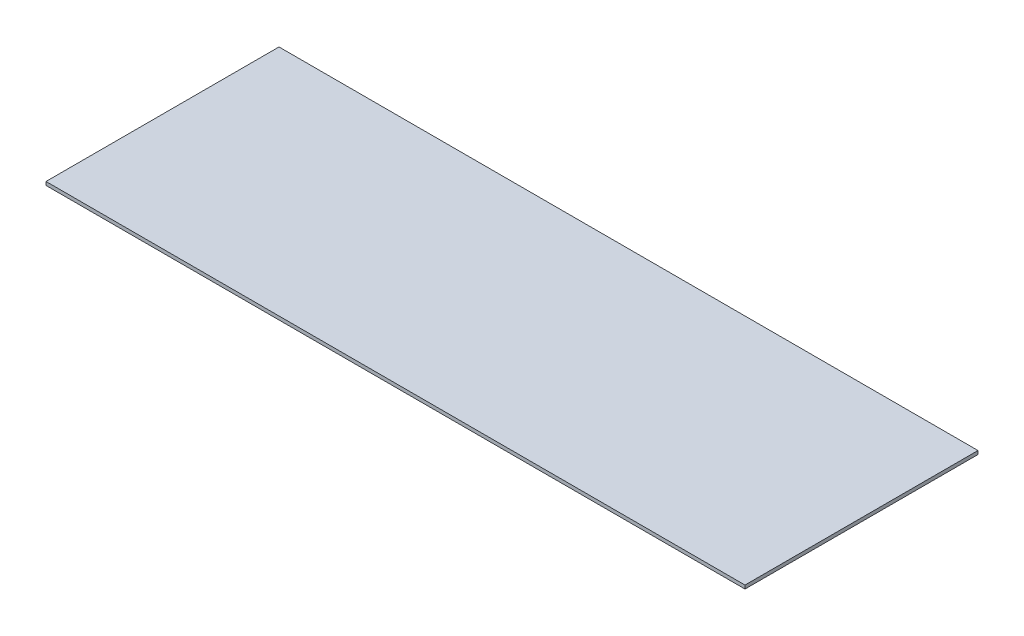
ISO-10303-21;
HEADER;
FILE_DESCRIPTION(('STEP AP214'),'2;1');
FILE_NAME('part.step','',(''),(''),'','','');
FILE_SCHEMA(('AUTOMOTIVE_DESIGN { 1 0 10303 214 1 1 1 1 }'));
ENDSEC;
DATA;
#1=APPLICATION_CONTEXT('core data for automotive mechanical design processes');
#2=APPLICATION_PROTOCOL_DEFINITION('international standard','automotive_design',2000,#1);
#3=PRODUCT_CONTEXT('',#1,'mechanical');
#4=PRODUCT('Part','Part','',(#3));
#5=PRODUCT_RELATED_PRODUCT_CATEGORY('part','',(#4));
#6=PRODUCT_DEFINITION_FORMATION('','',#4);
#7=PRODUCT_DEFINITION_CONTEXT('part definition',#1,'design');
#8=PRODUCT_DEFINITION('design','',#6,#7);
#9=PRODUCT_DEFINITION_SHAPE('','',#8);
#10=(LENGTH_UNIT() NAMED_UNIT(*) SI_UNIT(.MILLI.,.METRE.));
#11=(NAMED_UNIT(*) PLANE_ANGLE_UNIT() SI_UNIT($,.RADIAN.));
#12=(NAMED_UNIT(*) SI_UNIT($,.STERADIAN.) SOLID_ANGLE_UNIT());
#13=UNCERTAINTY_MEASURE_WITH_UNIT(LENGTH_MEASURE(1.E-05),#10,'distance_accuracy_value','');
#14=(GEOMETRIC_REPRESENTATION_CONTEXT(3) GLOBAL_UNCERTAINTY_ASSIGNED_CONTEXT((#13)) GLOBAL_UNIT_ASSIGNED_CONTEXT((#10,
#11,#12)) REPRESENTATION_CONTEXT('',''));
#15=CARTESIAN_POINT('',(0.,0.,0.));
#16=DIRECTION('',(0.,0.,1.));
#17=DIRECTION('',(1.,0.,0.));
#18=AXIS2_PLACEMENT_3D('',#15,#16,#17);
#19=CARTESIAN_POINT('',(-600.,6.,200.));
#20=DIRECTION('',(1.,0.,0.));
#21=DIRECTION('',(0.,0.,-1.));
#22=AXIS2_PLACEMENT_3D('',#19,#20,#21);
#23=PLANE('',#22);
#24=DIRECTION('',(0.,0.,1.));
#25=VECTOR('',#24,1.);
#26=CARTESIAN_POINT('',(-600.,0.,200.));
#27=LINE('',#26,#25);
#28=CARTESIAN_POINT('',(-600.,0.,-200.));
#29=VERTEX_POINT('',#28);
#30=CARTESIAN_POINT('',(-600.,0.,200.));
#31=VERTEX_POINT('',#30);
#32=EDGE_CURVE('E105',#29,#31,#27,.T.);
#33=ORIENTED_EDGE('',*,*,#32,.T.);
#34=DIRECTION('',(0.,-1.,0.));
#35=VECTOR('',#34,1.);
#36=CARTESIAN_POINT('',(-600.,6.,200.));
#37=LINE('',#36,#35);
#38=CARTESIAN_POINT('',(-600.,6.,200.));
#39=VERTEX_POINT('',#38);
#40=EDGE_CURVE('E11',#39,#31,#37,.T.);
#41=ORIENTED_EDGE('',*,*,#40,.F.);
#42=DIRECTION('',(0.,0.,1.));
#43=VECTOR('',#42,1.);
#44=CARTESIAN_POINT('',(-600.,6.,200.));
#45=LINE('',#44,#43);
#46=CARTESIAN_POINT('',(-600.,6.,-200.));
#47=VERTEX_POINT('',#46);
#48=EDGE_CURVE('E89',#47,#39,#45,.T.);
#49=ORIENTED_EDGE('',*,*,#48,.F.);
#50=DIRECTION('',(0.,-1.,0.));
#51=VECTOR('',#50,1.);
#52=CARTESIAN_POINT('',(-600.,6.,-200.));
#53=LINE('',#52,#51);
#54=EDGE_CURVE('E97',#47,#29,#53,.T.);
#55=ORIENTED_EDGE('',*,*,#54,.T.);
#56=EDGE_LOOP('',(#33,#41,#49,#55));
#57=FACE_BOUND('',#56,.T.);
#58=ADVANCED_FACE('F39',(#57),#23,.F.);
#59=CARTESIAN_POINT('',(600.,6.,200.));
#60=DIRECTION('',(0.,0.,-1.));
#61=DIRECTION('',(-1.,0.,0.));
#62=AXIS2_PLACEMENT_3D('',#59,#60,#61);
#63=PLANE('',#62);
#64=DIRECTION('',(1.,0.,0.));
#65=VECTOR('',#64,1.);
#66=CARTESIAN_POINT('',(600.,0.,200.));
#67=LINE('',#66,#65);
#68=CARTESIAN_POINT('',(600.,0.,200.));
#69=VERTEX_POINT('',#68);
#70=EDGE_CURVE('E92',#31,#69,#67,.T.);
#71=ORIENTED_EDGE('',*,*,#70,.T.);
#72=DIRECTION('',(0.,-1.,0.));
#73=VECTOR('',#72,1.);
#74=CARTESIAN_POINT('',(600.,6.,200.));
#75=LINE('',#74,#73);
#76=CARTESIAN_POINT('',(600.,6.,200.));
#77=VERTEX_POINT('',#76);
#78=EDGE_CURVE('E50',#77,#69,#75,.T.);
#79=ORIENTED_EDGE('',*,*,#78,.F.);
#80=DIRECTION('',(1.,0.,0.));
#81=VECTOR('',#80,1.);
#82=CARTESIAN_POINT('',(600.,6.,200.));
#83=LINE('',#82,#81);
#84=EDGE_CURVE('E82',#39,#77,#83,.T.);
#85=ORIENTED_EDGE('',*,*,#84,.F.);
#86=ORIENTED_EDGE('',*,*,#40,.T.);
#87=EDGE_LOOP('',(#71,#79,#85,#86));
#88=FACE_BOUND('',#87,.T.);
#89=ADVANCED_FACE('F93',(#88),#63,.F.);
#90=CARTESIAN_POINT('',(600.,6.,200.));
#91=DIRECTION('',(-1.,0.,0.));
#92=DIRECTION('',(0.,0.,1.));
#93=AXIS2_PLACEMENT_3D('',#90,#91,#92);
#94=PLANE('',#93);
#95=DIRECTION('',(0.,0.,-1.));
#96=VECTOR('',#95,1.);
#97=CARTESIAN_POINT('',(600.,0.,200.));
#98=LINE('',#97,#96);
#99=CARTESIAN_POINT('',(600.,0.,-200.));
#100=VERTEX_POINT('',#99);
#101=EDGE_CURVE('E72',#69,#100,#98,.T.);
#102=ORIENTED_EDGE('',*,*,#101,.T.);
#103=DIRECTION('',(0.,-1.,0.));
#104=VECTOR('',#103,1.);
#105=CARTESIAN_POINT('',(600.,6.,-200.));
#106=LINE('',#105,#104);
#107=CARTESIAN_POINT('',(600.,6.,-200.));
#108=VERTEX_POINT('',#107);
#109=EDGE_CURVE('E94',#108,#100,#106,.T.);
#110=ORIENTED_EDGE('',*,*,#109,.F.);
#111=DIRECTION('',(0.,0.,-1.));
#112=VECTOR('',#111,1.);
#113=CARTESIAN_POINT('',(600.,6.,200.));
#114=LINE('',#113,#112);
#115=EDGE_CURVE('E88',#77,#108,#114,.T.);
#116=ORIENTED_EDGE('',*,*,#115,.F.);
#117=ORIENTED_EDGE('',*,*,#78,.T.);
#118=EDGE_LOOP('',(#102,#110,#116,#117));
#119=FACE_BOUND('',#118,.T.);
#120=ADVANCED_FACE('F96',(#119),#94,.F.);
#121=CARTESIAN_POINT('',(600.,6.,-200.));
#122=DIRECTION('',(0.,0.,1.));
#123=DIRECTION('',(1.,0.,0.));
#124=AXIS2_PLACEMENT_3D('',#121,#122,#123);
#125=PLANE('',#124);
#126=DIRECTION('',(-1.,0.,0.));
#127=VECTOR('',#126,1.);
#128=CARTESIAN_POINT('',(600.,0.,-200.));
#129=LINE('',#128,#127);
#130=EDGE_CURVE('E76',#100,#29,#129,.T.);
#131=ORIENTED_EDGE('',*,*,#130,.T.);
#132=ORIENTED_EDGE('',*,*,#54,.F.);
#133=DIRECTION('',(-1.,0.,0.));
#134=VECTOR('',#133,1.);
#135=CARTESIAN_POINT('',(600.,6.,-200.));
#136=LINE('',#135,#134);
#137=EDGE_CURVE('E54',#108,#47,#136,.T.);
#138=ORIENTED_EDGE('',*,*,#137,.F.);
#139=ORIENTED_EDGE('',*,*,#109,.T.);
#140=EDGE_LOOP('',(#131,#132,#138,#139));
#141=FACE_BOUND('',#140,.T.);
#142=ADVANCED_FACE('F108',(#141),#125,.F.);
#143=CARTESIAN_POINT('',(0.,6.,0.));
#144=DIRECTION('',(0.,1.,0.));
#145=DIRECTION('',(0.,0.,1.));
#146=AXIS2_PLACEMENT_3D('',#143,#144,#145);
#147=PLANE('',#146);
#148=ORIENTED_EDGE('',*,*,#48,.T.);
#149=ORIENTED_EDGE('',*,*,#84,.T.);
#150=ORIENTED_EDGE('',*,*,#115,.T.);
#151=ORIENTED_EDGE('',*,*,#137,.T.);
#152=EDGE_LOOP('',(#148,#149,#150,#151));
#153=FACE_BOUND('',#152,.T.);
#154=ADVANCED_FACE('F86',(#153),#147,.T.);
#155=CARTESIAN_POINT('',(0.,0.,0.));
#156=DIRECTION('',(0.,1.,0.));
#157=DIRECTION('',(0.,0.,1.));
#158=AXIS2_PLACEMENT_3D('',#155,#156,#157);
#159=PLANE('',#158);
#160=ORIENTED_EDGE('',*,*,#32,.F.);
#161=ORIENTED_EDGE('',*,*,#130,.F.);
#162=ORIENTED_EDGE('',*,*,#101,.F.);
#163=ORIENTED_EDGE('',*,*,#70,.F.);
#164=EDGE_LOOP('',(#160,#161,#162,#163));
#165=FACE_BOUND('',#164,.T.);
#166=ADVANCED_FACE('F115',(#165),#159,.F.);
#167=CLOSED_SHELL('',(#58,#89,#120,#142,#154,#166));
#168=MANIFOLD_SOLID_BREP('B2',#167);
#169=ADVANCED_BREP_SHAPE_REPRESENTATION('',(#18,#168),#14);
#170=SHAPE_DEFINITION_REPRESENTATION(#9,#169);
ENDSEC;
END-ISO-10303-21;
